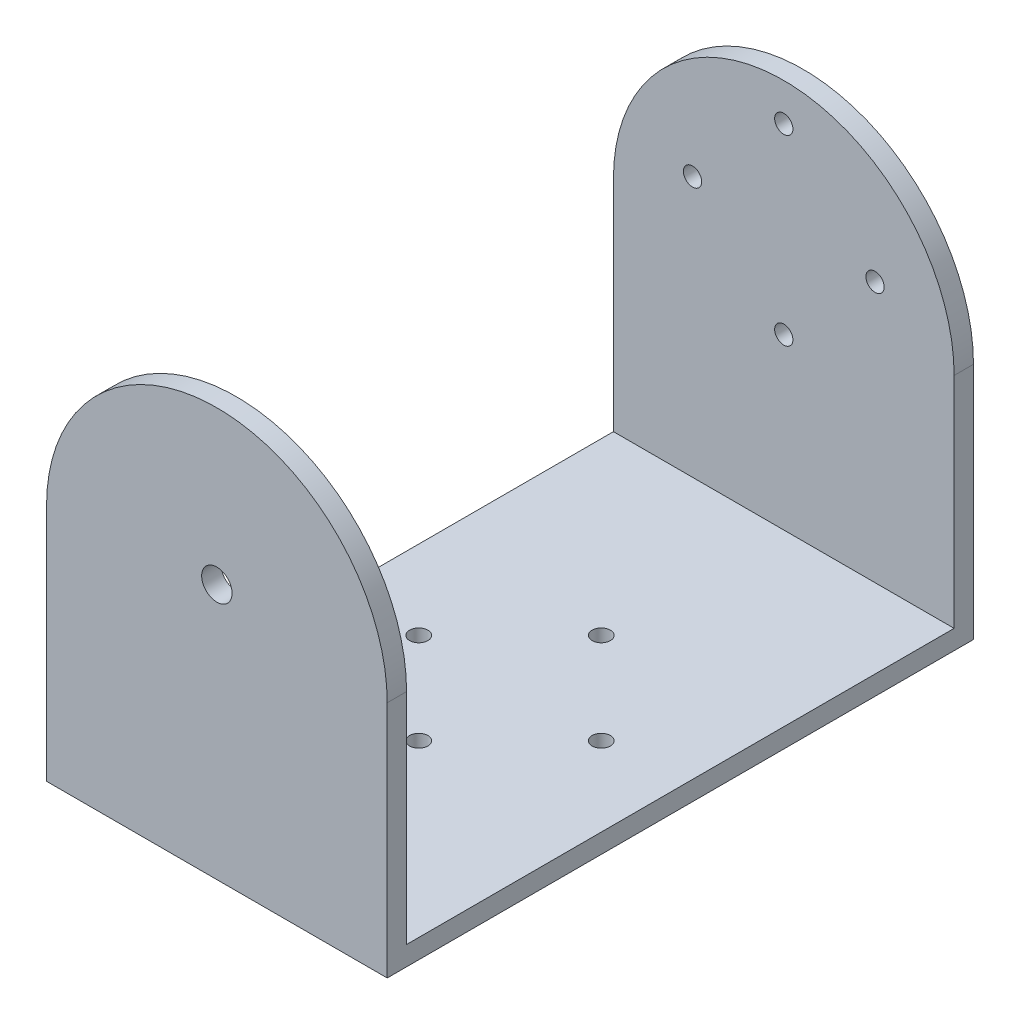
ISO-10303-21;
HEADER;
FILE_DESCRIPTION(('STEP AP214'),'2;1');
FILE_NAME('part.step','',(''),(''),'','','');
FILE_SCHEMA(('AUTOMOTIVE_DESIGN { 1 0 10303 214 1 1 1 1 }'));
ENDSEC;
DATA;
#1=APPLICATION_CONTEXT('core data for automotive mechanical design processes');
#2=APPLICATION_PROTOCOL_DEFINITION('international standard','automotive_design',2000,#1);
#3=PRODUCT_CONTEXT('',#1,'mechanical');
#4=PRODUCT('Part','Part','',(#3));
#5=PRODUCT_RELATED_PRODUCT_CATEGORY('part','',(#4));
#6=PRODUCT_DEFINITION_FORMATION('','',#4);
#7=PRODUCT_DEFINITION_CONTEXT('part definition',#1,'design');
#8=PRODUCT_DEFINITION('design','',#6,#7);
#9=PRODUCT_DEFINITION_SHAPE('','',#8);
#10=(LENGTH_UNIT() NAMED_UNIT(*) SI_UNIT(.MILLI.,.METRE.));
#11=(NAMED_UNIT(*) PLANE_ANGLE_UNIT() SI_UNIT($,.RADIAN.));
#12=(NAMED_UNIT(*) SI_UNIT($,.STERADIAN.) SOLID_ANGLE_UNIT());
#13=UNCERTAINTY_MEASURE_WITH_UNIT(LENGTH_MEASURE(1.E-05),#10,'distance_accuracy_value','');
#14=(GEOMETRIC_REPRESENTATION_CONTEXT(3) GLOBAL_UNCERTAINTY_ASSIGNED_CONTEXT((#13)) GLOBAL_UNIT_ASSIGNED_CONTEXT((#10,
#11,#12)) REPRESENTATION_CONTEXT('',''));
#15=CARTESIAN_POINT('',(0.,0.,0.));
#16=DIRECTION('',(0.,0.,1.));
#17=DIRECTION('',(1.,0.,0.));
#18=AXIS2_PLACEMENT_3D('',#15,#16,#17);
#19=CARTESIAN_POINT('',(0.,1.59,0.));
#20=DIRECTION('',(0.,1.,0.));
#21=DIRECTION('',(0.,0.,1.));
#22=AXIS2_PLACEMENT_3D('',#19,#20,#21);
#23=PLANE('',#22);
#24=CARTESIAN_POINT('',(7.5,1.59,0.));
#25=DIRECTION('',(0.,1.,0.));
#26=DIRECTION('',(0.,0.,1.));
#27=AXIS2_PLACEMENT_3D('',#24,#25,#26);
#28=CIRCLE('',#27,0.75);
#29=CARTESIAN_POINT('',(7.5,1.59,-0.75));
#30=VERTEX_POINT('',#29);
#31=EDGE_CURVE('E158',#30,#30,#28,.T.);
#32=ORIENTED_EDGE('',*,*,#31,.F.);
#33=EDGE_LOOP('',(#32));
#34=FACE_BOUND('',#33,.T.);
#35=CARTESIAN_POINT('',(0.,1.59,-7.5));
#36=DIRECTION('',(0.,1.,0.));
#37=DIRECTION('',(0.,0.,1.));
#38=AXIS2_PLACEMENT_3D('',#35,#36,#37);
#39=CIRCLE('',#38,0.75);
#40=CARTESIAN_POINT('',(0.,1.59,-8.25));
#41=VERTEX_POINT('',#40);
#42=EDGE_CURVE('E170',#41,#41,#39,.T.);
#43=ORIENTED_EDGE('',*,*,#42,.F.);
#44=EDGE_LOOP('',(#43));
#45=FACE_BOUND('',#44,.T.);
#46=CARTESIAN_POINT('',(0.,1.59,7.5));
#47=DIRECTION('',(0.,1.,0.));
#48=DIRECTION('',(0.,0.,1.));
#49=AXIS2_PLACEMENT_3D('',#46,#47,#48);
#50=CIRCLE('',#49,0.75);
#51=CARTESIAN_POINT('',(0.,1.59,6.75));
#52=VERTEX_POINT('',#51);
#53=EDGE_CURVE('E164',#52,#52,#50,.T.);
#54=ORIENTED_EDGE('',*,*,#53,.F.);
#55=EDGE_LOOP('',(#54));
#56=FACE_BOUND('',#55,.T.);
#57=CARTESIAN_POINT('',(-7.5,1.59,0.));
#58=DIRECTION('',(0.,1.,0.));
#59=DIRECTION('',(0.,0.,1.));
#60=AXIS2_PLACEMENT_3D('',#57,#58,#59);
#61=CIRCLE('',#60,0.75);
#62=CARTESIAN_POINT('',(-7.5,1.59,-0.75));
#63=VERTEX_POINT('',#62);
#64=EDGE_CURVE('E152',#63,#63,#61,.T.);
#65=ORIENTED_EDGE('',*,*,#64,.F.);
#66=EDGE_LOOP('',(#65));
#67=FACE_BOUND('',#66,.T.);
#68=DIRECTION('',(0.,0.,1.));
#69=VECTOR('',#68,1.);
#70=CARTESIAN_POINT('',(-14.,1.59,-24.09));
#71=LINE('',#70,#69);
#72=CARTESIAN_POINT('',(-14.,1.59,-22.5));
#73=VERTEX_POINT('',#72);
#74=CARTESIAN_POINT('',(-14.,1.59,22.5));
#75=VERTEX_POINT('',#74);
#76=EDGE_CURVE('E56',#73,#75,#71,.T.);
#77=ORIENTED_EDGE('',*,*,#76,.T.);
#78=DIRECTION('',(-1.,0.,0.));
#79=VECTOR('',#78,1.);
#80=CARTESIAN_POINT('',(-14.,1.59,22.5));
#81=LINE('',#80,#79);
#82=CARTESIAN_POINT('',(14.,1.59,22.5));
#83=VERTEX_POINT('',#82);
#84=EDGE_CURVE('E51',#83,#75,#81,.T.);
#85=ORIENTED_EDGE('',*,*,#84,.F.);
#86=DIRECTION('',(0.,0.,-1.));
#87=VECTOR('',#86,1.);
#88=CARTESIAN_POINT('',(14.,1.59,-24.09));
#89=LINE('',#88,#87);
#90=CARTESIAN_POINT('',(14.,1.59,-22.5));
#91=VERTEX_POINT('',#90);
#92=EDGE_CURVE('E176',#83,#91,#89,.T.);
#93=ORIENTED_EDGE('',*,*,#92,.T.);
#94=DIRECTION('',(1.,0.,0.));
#95=VECTOR('',#94,1.);
#96=CARTESIAN_POINT('',(-14.,1.59,-22.5));
#97=LINE('',#96,#95);
#98=EDGE_CURVE('E116',#73,#91,#97,.T.);
#99=ORIENTED_EDGE('',*,*,#98,.F.);
#100=EDGE_LOOP('',(#77,#85,#93,#99));
#101=FACE_BOUND('',#100,.T.);
#102=ADVANCED_FACE('F34',(#34,#45,#56,#67,#101),#23,.T.);
#103=CARTESIAN_POINT('',(0.,0.,0.));
#104=DIRECTION('',(0.,1.,0.));
#105=DIRECTION('',(0.,0.,1.));
#106=AXIS2_PLACEMENT_3D('',#103,#104,#105);
#107=PLANE('',#106);
#108=DIRECTION('',(0.,0.,-1.));
#109=VECTOR('',#108,1.);
#110=CARTESIAN_POINT('',(14.,0.,-24.09));
#111=LINE('',#110,#109);
#112=CARTESIAN_POINT('',(14.,0.,24.09));
#113=VERTEX_POINT('',#112);
#114=CARTESIAN_POINT('',(14.,0.,-24.09));
#115=VERTEX_POINT('',#114);
#116=EDGE_CURVE('E173',#113,#115,#111,.T.);
#117=ORIENTED_EDGE('',*,*,#116,.F.);
#118=DIRECTION('',(1.,0.,0.));
#119=VECTOR('',#118,1.);
#120=CARTESIAN_POINT('',(-14.,0.,24.09));
#121=LINE('',#120,#119);
#122=CARTESIAN_POINT('',(-14.,0.,24.09));
#123=VERTEX_POINT('',#122);
#124=EDGE_CURVE('E178',#123,#113,#121,.T.);
#125=ORIENTED_EDGE('',*,*,#124,.F.);
#126=DIRECTION('',(0.,0.,1.));
#127=VECTOR('',#126,1.);
#128=CARTESIAN_POINT('',(-14.,0.,-24.09));
#129=LINE('',#128,#127);
#130=CARTESIAN_POINT('',(-14.,0.,-24.09));
#131=VERTEX_POINT('',#130);
#132=EDGE_CURVE('E184',#131,#123,#129,.T.);
#133=ORIENTED_EDGE('',*,*,#132,.F.);
#134=DIRECTION('',(-1.,0.,0.));
#135=VECTOR('',#134,1.);
#136=CARTESIAN_POINT('',(-14.,0.,-24.09));
#137=LINE('',#136,#135);
#138=EDGE_CURVE('E182',#115,#131,#137,.T.);
#139=ORIENTED_EDGE('',*,*,#138,.F.);
#140=EDGE_LOOP('',(#117,#125,#133,#139));
#141=FACE_BOUND('',#140,.T.);
#142=CARTESIAN_POINT('',(0.,0.,-7.5));
#143=DIRECTION('',(0.,1.,0.));
#144=DIRECTION('',(0.,0.,1.));
#145=AXIS2_PLACEMENT_3D('',#142,#143,#144);
#146=CIRCLE('',#145,0.75);
#147=CARTESIAN_POINT('',(0.,0.,-8.25));
#148=VERTEX_POINT('',#147);
#149=EDGE_CURVE('E167',#148,#148,#146,.T.);
#150=ORIENTED_EDGE('',*,*,#149,.T.);
#151=EDGE_LOOP('',(#150));
#152=FACE_BOUND('',#151,.T.);
#153=CARTESIAN_POINT('',(0.,0.,7.5));
#154=DIRECTION('',(0.,1.,0.));
#155=DIRECTION('',(0.,0.,1.));
#156=AXIS2_PLACEMENT_3D('',#153,#154,#155);
#157=CIRCLE('',#156,0.75);
#158=CARTESIAN_POINT('',(0.,0.,6.75));
#159=VERTEX_POINT('',#158);
#160=EDGE_CURVE('E161',#159,#159,#157,.T.);
#161=ORIENTED_EDGE('',*,*,#160,.T.);
#162=EDGE_LOOP('',(#161));
#163=FACE_BOUND('',#162,.T.);
#164=CARTESIAN_POINT('',(7.5,0.,0.));
#165=DIRECTION('',(0.,1.,0.));
#166=DIRECTION('',(0.,0.,1.));
#167=AXIS2_PLACEMENT_3D('',#164,#165,#166);
#168=CIRCLE('',#167,0.75);
#169=CARTESIAN_POINT('',(7.5,0.,-0.75));
#170=VERTEX_POINT('',#169);
#171=EDGE_CURVE('E155',#170,#170,#168,.T.);
#172=ORIENTED_EDGE('',*,*,#171,.T.);
#173=EDGE_LOOP('',(#172));
#174=FACE_BOUND('',#173,.T.);
#175=CARTESIAN_POINT('',(-7.5,0.,0.));
#176=DIRECTION('',(0.,1.,0.));
#177=DIRECTION('',(0.,0.,1.));
#178=AXIS2_PLACEMENT_3D('',#175,#176,#177);
#179=CIRCLE('',#178,0.75);
#180=CARTESIAN_POINT('',(-7.5,0.,-0.75));
#181=VERTEX_POINT('',#180);
#182=EDGE_CURVE('E151',#181,#181,#179,.T.);
#183=ORIENTED_EDGE('',*,*,#182,.T.);
#184=EDGE_LOOP('',(#183));
#185=FACE_BOUND('',#184,.T.);
#186=ADVANCED_FACE('F240',(#141,#152,#163,#174,#185),#107,.F.);
#187=CARTESIAN_POINT('',(14.,1.59,-24.09));
#188=DIRECTION('',(-1.,0.,0.));
#189=DIRECTION('',(0.,0.,1.));
#190=AXIS2_PLACEMENT_3D('',#187,#188,#189);
#191=PLANE('',#190);
#192=ORIENTED_EDGE('',*,*,#116,.T.);
#193=DIRECTION('',(0.,-1.,0.));
#194=VECTOR('',#193,1.);
#195=CARTESIAN_POINT('',(14.,1.59,-24.09));
#196=LINE('',#195,#194);
#197=CARTESIAN_POINT('',(14.,19.59,-24.09));
#198=VERTEX_POINT('',#197);
#199=EDGE_CURVE('E11',#198,#115,#196,.T.);
#200=ORIENTED_EDGE('',*,*,#199,.F.);
#201=DIRECTION('',(0.,0.,-1.));
#202=VECTOR('',#201,1.);
#203=CARTESIAN_POINT('',(14.,19.59,-24.09));
#204=LINE('',#203,#202);
#205=CARTESIAN_POINT('',(14.,19.59,-22.5));
#206=VERTEX_POINT('',#205);
#207=EDGE_CURVE('E99',#206,#198,#204,.T.);
#208=ORIENTED_EDGE('',*,*,#207,.F.);
#209=DIRECTION('',(0.,-1.,0.));
#210=VECTOR('',#209,1.);
#211=CARTESIAN_POINT('',(14.,19.59,-22.5));
#212=LINE('',#211,#210);
#213=EDGE_CURVE('E102',#206,#91,#212,.T.);
#214=ORIENTED_EDGE('',*,*,#213,.T.);
#215=ORIENTED_EDGE('',*,*,#92,.F.);
#216=DIRECTION('',(0.,-1.,0.));
#217=VECTOR('',#216,1.);
#218=CARTESIAN_POINT('',(14.,19.59,22.5));
#219=LINE('',#218,#217);
#220=CARTESIAN_POINT('',(14.,19.59,22.5));
#221=VERTEX_POINT('',#220);
#222=EDGE_CURVE('E145',#221,#83,#219,.T.);
#223=ORIENTED_EDGE('',*,*,#222,.F.);
#224=DIRECTION('',(0.,0.,-1.));
#225=VECTOR('',#224,1.);
#226=CARTESIAN_POINT('',(14.,19.59,24.09));
#227=LINE('',#226,#225);
#228=CARTESIAN_POINT('',(14.,19.59,24.09));
#229=VERTEX_POINT('',#228);
#230=EDGE_CURVE('E138',#229,#221,#227,.T.);
#231=ORIENTED_EDGE('',*,*,#230,.F.);
#232=DIRECTION('',(0.,-1.,0.));
#233=VECTOR('',#232,1.);
#234=CARTESIAN_POINT('',(14.,1.59,24.09));
#235=LINE('',#234,#233);
#236=EDGE_CURVE('E180',#229,#113,#235,.T.);
#237=ORIENTED_EDGE('',*,*,#236,.T.);
#238=EDGE_LOOP('',(#192,#200,#208,#214,#215,#223,#231,#237));
#239=FACE_BOUND('',#238,.T.);
#240=ADVANCED_FACE('F36',(#239),#191,.F.);
#241=CARTESIAN_POINT('',(-14.,1.59,-24.09));
#242=DIRECTION('',(0.,0.,1.));
#243=DIRECTION('',(1.,0.,0.));
#244=AXIS2_PLACEMENT_3D('',#241,#242,#243);
#245=PLANE('',#244);
#246=CARTESIAN_POINT('',(0.,15.5,-24.09));
#247=DIRECTION('',(0.,0.,-1.));
#248=DIRECTION('',(-1.,0.,0.));
#249=AXIS2_PLACEMENT_3D('',#246,#247,#248);
#250=CIRCLE('',#249,0.750000000000001);
#251=CARTESIAN_POINT('',(-0.750000000000001,15.5,-24.09));
#252=VERTEX_POINT('',#251);
#253=EDGE_CURVE('E203',#252,#252,#250,.T.);
#254=ORIENTED_EDGE('',*,*,#253,.F.);
#255=EDGE_LOOP('',(#254));
#256=FACE_BOUND('',#255,.T.);
#257=CARTESIAN_POINT('',(-7.5,23.,-24.09));
#258=DIRECTION('',(0.,0.,-1.));
#259=DIRECTION('',(-1.,0.,0.));
#260=AXIS2_PLACEMENT_3D('',#257,#258,#259);
#261=CIRCLE('',#260,0.75);
#262=CARTESIAN_POINT('',(-8.25,23.,-24.09));
#263=VERTEX_POINT('',#262);
#264=EDGE_CURVE('E217',#263,#263,#261,.T.);
#265=ORIENTED_EDGE('',*,*,#264,.F.);
#266=EDGE_LOOP('',(#265));
#267=FACE_BOUND('',#266,.T.);
#268=CARTESIAN_POINT('',(7.5,23.,-24.09));
#269=DIRECTION('',(0.,0.,-1.));
#270=DIRECTION('',(-1.,0.,0.));
#271=AXIS2_PLACEMENT_3D('',#268,#269,#270);
#272=CIRCLE('',#271,0.75);
#273=CARTESIAN_POINT('',(6.75,23.,-24.09));
#274=VERTEX_POINT('',#273);
#275=EDGE_CURVE('E214',#274,#274,#272,.T.);
#276=ORIENTED_EDGE('',*,*,#275,.F.);
#277=EDGE_LOOP('',(#276));
#278=FACE_BOUND('',#277,.T.);
#279=CARTESIAN_POINT('',(0.,30.5,-24.09));
#280=DIRECTION('',(0.,0.,-1.));
#281=DIRECTION('',(-1.,0.,0.));
#282=AXIS2_PLACEMENT_3D('',#279,#280,#281);
#283=CIRCLE('',#282,0.750000000000001);
#284=CARTESIAN_POINT('',(-0.750000000000001,30.5,-24.09));
#285=VERTEX_POINT('',#284);
#286=EDGE_CURVE('E199',#285,#285,#283,.T.);
#287=ORIENTED_EDGE('',*,*,#286,.F.);
#288=EDGE_LOOP('',(#287));
#289=FACE_BOUND('',#288,.T.);
#290=ORIENTED_EDGE('',*,*,#138,.T.);
#291=DIRECTION('',(0.,-1.,0.));
#292=VECTOR('',#291,1.);
#293=CARTESIAN_POINT('',(-14.,1.59,-24.09));
#294=LINE('',#293,#292);
#295=CARTESIAN_POINT('',(-14.,19.59,-24.09));
#296=VERTEX_POINT('',#295);
#297=EDGE_CURVE('E43',#296,#131,#294,.T.);
#298=ORIENTED_EDGE('',*,*,#297,.F.);
#299=CARTESIAN_POINT('',(0.,19.59,-24.09));
#300=DIRECTION('',(0.,0.,-1.));
#301=DIRECTION('',(-1.,0.,0.));
#302=AXIS2_PLACEMENT_3D('',#299,#300,#301);
#303=CIRCLE('',#302,14.);
#304=EDGE_CURVE('E122',#296,#198,#303,.T.);
#305=ORIENTED_EDGE('',*,*,#304,.T.);
#306=ORIENTED_EDGE('',*,*,#199,.T.);
#307=EDGE_LOOP('',(#290,#298,#305,#306));
#308=FACE_BOUND('',#307,.T.);
#309=ADVANCED_FACE('F226',(#256,#267,#278,#289,#308),#245,.F.);
#310=CARTESIAN_POINT('',(-14.,1.59,-24.09));
#311=DIRECTION('',(1.,0.,0.));
#312=DIRECTION('',(0.,0.,-1.));
#313=AXIS2_PLACEMENT_3D('',#310,#311,#312);
#314=PLANE('',#313);
#315=ORIENTED_EDGE('',*,*,#132,.T.);
#316=DIRECTION('',(0.,-1.,0.));
#317=VECTOR('',#316,1.);
#318=CARTESIAN_POINT('',(-14.,1.59,24.09));
#319=LINE('',#318,#317);
#320=CARTESIAN_POINT('',(-14.,19.59,24.09));
#321=VERTEX_POINT('',#320);
#322=EDGE_CURVE('E189',#321,#123,#319,.T.);
#323=ORIENTED_EDGE('',*,*,#322,.F.);
#324=DIRECTION('',(0.,0.,1.));
#325=VECTOR('',#324,1.);
#326=CARTESIAN_POINT('',(-14.,19.59,24.09));
#327=LINE('',#326,#325);
#328=CARTESIAN_POINT('',(-14.,19.59,22.5));
#329=VERTEX_POINT('',#328);
#330=EDGE_CURVE('E135',#329,#321,#327,.T.);
#331=ORIENTED_EDGE('',*,*,#330,.F.);
#332=DIRECTION('',(0.,-1.,0.));
#333=VECTOR('',#332,1.);
#334=CARTESIAN_POINT('',(-14.,19.59,22.5));
#335=LINE('',#334,#333);
#336=EDGE_CURVE('E141',#329,#75,#335,.T.);
#337=ORIENTED_EDGE('',*,*,#336,.T.);
#338=ORIENTED_EDGE('',*,*,#76,.F.);
#339=DIRECTION('',(0.,-1.,0.));
#340=VECTOR('',#339,1.);
#341=CARTESIAN_POINT('',(-14.,19.59,-22.5));
#342=LINE('',#341,#340);
#343=CARTESIAN_POINT('',(-14.,19.59,-22.5));
#344=VERTEX_POINT('',#343);
#345=EDGE_CURVE('E117',#344,#73,#342,.T.);
#346=ORIENTED_EDGE('',*,*,#345,.F.);
#347=DIRECTION('',(0.,0.,1.));
#348=VECTOR('',#347,1.);
#349=CARTESIAN_POINT('',(-14.,19.59,-24.09));
#350=LINE('',#349,#348);
#351=EDGE_CURVE('E107',#296,#344,#350,.T.);
#352=ORIENTED_EDGE('',*,*,#351,.F.);
#353=ORIENTED_EDGE('',*,*,#297,.T.);
#354=EDGE_LOOP('',(#315,#323,#331,#337,#338,#346,#352,#353));
#355=FACE_BOUND('',#354,.T.);
#356=ADVANCED_FACE('F229',(#355),#314,.F.);
#357=CARTESIAN_POINT('',(-14.,1.59,24.09));
#358=DIRECTION('',(0.,0.,-1.));
#359=DIRECTION('',(-1.,0.,0.));
#360=AXIS2_PLACEMENT_3D('',#357,#358,#359);
#361=PLANE('',#360);
#362=CARTESIAN_POINT('',(0.,21.,24.09));
#363=DIRECTION('',(0.,0.,1.));
#364=DIRECTION('',(1.,0.,0.));
#365=AXIS2_PLACEMENT_3D('',#362,#363,#364);
#366=CIRCLE('',#365,1.25);
#367=CARTESIAN_POINT('',(1.25,21.,24.09));
#368=VERTEX_POINT('',#367);
#369=EDGE_CURVE('E130',#368,#368,#366,.T.);
#370=ORIENTED_EDGE('',*,*,#369,.F.);
#371=EDGE_LOOP('',(#370));
#372=FACE_BOUND('',#371,.T.);
#373=ORIENTED_EDGE('',*,*,#124,.T.);
#374=ORIENTED_EDGE('',*,*,#236,.F.);
#375=CARTESIAN_POINT('',(0.,19.59,24.09));
#376=DIRECTION('',(0.,0.,1.));
#377=DIRECTION('',(1.,0.,0.));
#378=AXIS2_PLACEMENT_3D('',#375,#376,#377);
#379=CIRCLE('',#378,14.);
#380=EDGE_CURVE('E121',#229,#321,#379,.T.);
#381=ORIENTED_EDGE('',*,*,#380,.T.);
#382=ORIENTED_EDGE('',*,*,#322,.T.);
#383=EDGE_LOOP('',(#373,#374,#381,#382));
#384=FACE_BOUND('',#383,.T.);
#385=ADVANCED_FACE('F243',(#372,#384),#361,.F.);
#386=CARTESIAN_POINT('',(0.,1.59,-7.5));
#387=DIRECTION('',(0.,-1.,0.));
#388=DIRECTION('',(0.,0.,-1.));
#389=AXIS2_PLACEMENT_3D('',#386,#387,#388);
#390=CYLINDRICAL_SURFACE('',#389,0.75);
#391=CARTESIAN_POINT('',(0.,1.59,-8.25));
#392=CARTESIAN_POINT('',(0.,1.5734375,-8.25));
#393=CARTESIAN_POINT('',(0.,1.556875,-8.25));
#394=CARTESIAN_POINT('',(0.,1.52375,-8.25));
#395=CARTESIAN_POINT('',(0.,1.5071875,-8.25));
#396=CARTESIAN_POINT('',(0.,1.4740625,-8.25));
#397=CARTESIAN_POINT('',(0.,1.4575,-8.25));
#398=CARTESIAN_POINT('',(0.,1.424375,-8.25));
#399=CARTESIAN_POINT('',(0.,1.4078125,-8.25));
#400=CARTESIAN_POINT('',(0.,1.3746875,-8.25));
#401=CARTESIAN_POINT('',(0.,1.358125,-8.25));
#402=CARTESIAN_POINT('',(0.,1.325,-8.25));
#403=CARTESIAN_POINT('',(0.,1.3084375,-8.25));
#404=CARTESIAN_POINT('',(0.,1.2753125,-8.25));
#405=CARTESIAN_POINT('',(0.,1.25875,-8.25));
#406=CARTESIAN_POINT('',(0.,1.225625,-8.25));
#407=CARTESIAN_POINT('',(0.,1.2090625,-8.25));
#408=CARTESIAN_POINT('',(0.,1.1759375,-8.25));
#409=CARTESIAN_POINT('',(0.,1.159375,-8.25));
#410=CARTESIAN_POINT('',(0.,1.12625,-8.25));
#411=CARTESIAN_POINT('',(0.,1.1096875,-8.25));
#412=CARTESIAN_POINT('',(0.,1.0765625,-8.25));
#413=CARTESIAN_POINT('',(0.,1.06,-8.25));
#414=CARTESIAN_POINT('',(0.,1.026875,-8.25));
#415=CARTESIAN_POINT('',(0.,1.0103125,-8.25));
#416=CARTESIAN_POINT('',(0.,0.9771875,-8.25));
#417=CARTESIAN_POINT('',(0.,0.960625,-8.25));
#418=CARTESIAN_POINT('',(0.,0.9275,-8.25));
#419=CARTESIAN_POINT('',(0.,0.9109375,-8.25));
#420=CARTESIAN_POINT('',(0.,0.8778125,-8.25));
#421=CARTESIAN_POINT('',(0.,0.86125,-8.25));
#422=CARTESIAN_POINT('',(0.,0.828125,-8.25));
#423=CARTESIAN_POINT('',(0.,0.8115625,-8.25));
#424=CARTESIAN_POINT('',(0.,0.7784375,-8.25));
#425=CARTESIAN_POINT('',(0.,0.761875,-8.25));
#426=CARTESIAN_POINT('',(0.,0.72875,-8.25));
#427=CARTESIAN_POINT('',(0.,0.7121875,-8.25));
#428=CARTESIAN_POINT('',(0.,0.6790625,-8.25));
#429=CARTESIAN_POINT('',(0.,0.6625,-8.25));
#430=CARTESIAN_POINT('',(0.,0.629375,-8.25));
#431=CARTESIAN_POINT('',(0.,0.6128125,-8.25));
#432=CARTESIAN_POINT('',(0.,0.5796875,-8.25));
#433=CARTESIAN_POINT('',(0.,0.563125,-8.25));
#434=CARTESIAN_POINT('',(0.,0.53,-8.25));
#435=CARTESIAN_POINT('',(0.,0.5134375,-8.25));
#436=CARTESIAN_POINT('',(0.,0.4803125,-8.25));
#437=CARTESIAN_POINT('',(0.,0.46375,-8.25));
#438=CARTESIAN_POINT('',(0.,0.430625,-8.25));
#439=CARTESIAN_POINT('',(0.,0.4140625,-8.25));
#440=CARTESIAN_POINT('',(0.,0.3809375,-8.25));
#441=CARTESIAN_POINT('',(0.,0.364375,-8.25));
#442=CARTESIAN_POINT('',(0.,0.33125,-8.25));
#443=CARTESIAN_POINT('',(0.,0.3146875,-8.25));
#444=CARTESIAN_POINT('',(0.,0.2815625,-8.25));
#445=CARTESIAN_POINT('',(0.,0.265,-8.25));
#446=CARTESIAN_POINT('',(0.,0.231875,-8.25));
#447=CARTESIAN_POINT('',(0.,0.2153125,-8.25));
#448=CARTESIAN_POINT('',(0.,0.1821875,-8.25));
#449=CARTESIAN_POINT('',(0.,0.165625,-8.25));
#450=CARTESIAN_POINT('',(0.,0.1325,-8.25));
#451=CARTESIAN_POINT('',(0.,0.1159375,-8.25));
#452=CARTESIAN_POINT('',(0.,0.0828125000000001,-8.25));
#453=CARTESIAN_POINT('',(0.,0.06625,-8.25));
#454=CARTESIAN_POINT('',(0.,0.033125,-8.25));
#455=CARTESIAN_POINT('',(0.,0.0165625,-8.25));
#456=CARTESIAN_POINT('',(0.,0.,-8.25));
#457=B_SPLINE_CURVE_WITH_KNOTS('',3,(#391,#392,#393,#394,#395,#396,#397,#398,#399,#400,#401,
#402,#403,#404,#405,#406,#407,#408,#409,#410,#411,#412,#413,#414,#415,#416,#417,#418,#419,#420,
#421,#422,#423,#424,#425,#426,#427,#428,#429,#430,#431,#432,#433,#434,#435,#436,#437,#438,#439,
#440,#441,#442,#443,#444,#445,#446,#447,#448,#449,#450,#451,#452,#453,#454,#455,#456),
.UNSPECIFIED.,.F.,.F.,(4,2,2,2,2,2,2,2,2,2,2,2,2,2,2,2,2,2,2,2,2,2,2,2,2,2,2,2,2,2,2,2,4),(0.,
0.0496874999999998,0.0993749999999999,0.1490625,0.19875,0.2484375,0.298125,0.3478125,0.3975,
0.4471875,0.496875,0.5465625,0.59625,0.6459375,0.695625,0.7453125,0.795,0.8446875,0.894375,
0.9440625,0.99375,1.0434375,1.093125,1.1428125,1.1925,1.2421875,1.291875,1.3415625,1.39125,
1.4409375,1.490625,1.5403125,1.59),.UNSPECIFIED.);
#458=EDGE_CURVE('BSEAM272',#41,#148,#457,.T.);
#459=ORIENTED_EDGE('',*,*,#42,.T.);
#460=ORIENTED_EDGE('',*,*,#149,.F.);
#461=ORIENTED_EDGE('',*,*,#458,.T.);
#462=ORIENTED_EDGE('',*,*,#458,.F.);
#463=EDGE_LOOP('',(#459,#461,#460,#462));
#464=FACE_BOUND('',#463,.T.);
#465=ADVANCED_FACE('F272',(#464),#390,.F.);
#466=CARTESIAN_POINT('',(0.,1.59,7.5));
#467=DIRECTION('',(0.,-1.,0.));
#468=DIRECTION('',(0.,0.,-1.));
#469=AXIS2_PLACEMENT_3D('',#466,#467,#468);
#470=CYLINDRICAL_SURFACE('',#469,0.75);
#471=CARTESIAN_POINT('',(0.,1.59,6.75));
#472=CARTESIAN_POINT('',(0.,1.5734375,6.75));
#473=CARTESIAN_POINT('',(0.,1.556875,6.75));
#474=CARTESIAN_POINT('',(0.,1.52375,6.75));
#475=CARTESIAN_POINT('',(0.,1.5071875,6.75));
#476=CARTESIAN_POINT('',(0.,1.4740625,6.75));
#477=CARTESIAN_POINT('',(0.,1.4575,6.75));
#478=CARTESIAN_POINT('',(0.,1.424375,6.75));
#479=CARTESIAN_POINT('',(0.,1.4078125,6.75));
#480=CARTESIAN_POINT('',(0.,1.3746875,6.75));
#481=CARTESIAN_POINT('',(0.,1.358125,6.75));
#482=CARTESIAN_POINT('',(0.,1.325,6.75));
#483=CARTESIAN_POINT('',(0.,1.3084375,6.75));
#484=CARTESIAN_POINT('',(0.,1.2753125,6.75));
#485=CARTESIAN_POINT('',(0.,1.25875,6.75));
#486=CARTESIAN_POINT('',(0.,1.225625,6.75));
#487=CARTESIAN_POINT('',(0.,1.2090625,6.75));
#488=CARTESIAN_POINT('',(0.,1.1759375,6.75));
#489=CARTESIAN_POINT('',(0.,1.159375,6.75));
#490=CARTESIAN_POINT('',(0.,1.12625,6.75));
#491=CARTESIAN_POINT('',(0.,1.1096875,6.75));
#492=CARTESIAN_POINT('',(0.,1.0765625,6.75));
#493=CARTESIAN_POINT('',(0.,1.06,6.75));
#494=CARTESIAN_POINT('',(0.,1.026875,6.75));
#495=CARTESIAN_POINT('',(0.,1.0103125,6.75));
#496=CARTESIAN_POINT('',(0.,0.9771875,6.75));
#497=CARTESIAN_POINT('',(0.,0.960625,6.75));
#498=CARTESIAN_POINT('',(0.,0.9275,6.75));
#499=CARTESIAN_POINT('',(0.,0.9109375,6.75));
#500=CARTESIAN_POINT('',(0.,0.8778125,6.75));
#501=CARTESIAN_POINT('',(0.,0.86125,6.75));
#502=CARTESIAN_POINT('',(0.,0.828125,6.75));
#503=CARTESIAN_POINT('',(0.,0.8115625,6.75));
#504=CARTESIAN_POINT('',(0.,0.7784375,6.75));
#505=CARTESIAN_POINT('',(0.,0.761875,6.75));
#506=CARTESIAN_POINT('',(0.,0.72875,6.75));
#507=CARTESIAN_POINT('',(0.,0.7121875,6.75));
#508=CARTESIAN_POINT('',(0.,0.6790625,6.75));
#509=CARTESIAN_POINT('',(0.,0.6625,6.75));
#510=CARTESIAN_POINT('',(0.,0.629375,6.75));
#511=CARTESIAN_POINT('',(0.,0.6128125,6.75));
#512=CARTESIAN_POINT('',(0.,0.5796875,6.75));
#513=CARTESIAN_POINT('',(0.,0.563125,6.75));
#514=CARTESIAN_POINT('',(0.,0.53,6.75));
#515=CARTESIAN_POINT('',(0.,0.5134375,6.75));
#516=CARTESIAN_POINT('',(0.,0.4803125,6.75));
#517=CARTESIAN_POINT('',(0.,0.46375,6.75));
#518=CARTESIAN_POINT('',(0.,0.430625,6.75));
#519=CARTESIAN_POINT('',(0.,0.4140625,6.75));
#520=CARTESIAN_POINT('',(0.,0.3809375,6.75));
#521=CARTESIAN_POINT('',(0.,0.364375,6.75));
#522=CARTESIAN_POINT('',(0.,0.33125,6.75));
#523=CARTESIAN_POINT('',(0.,0.3146875,6.75));
#524=CARTESIAN_POINT('',(0.,0.2815625,6.75));
#525=CARTESIAN_POINT('',(0.,0.265,6.75));
#526=CARTESIAN_POINT('',(0.,0.231875,6.75));
#527=CARTESIAN_POINT('',(0.,0.2153125,6.75));
#528=CARTESIAN_POINT('',(0.,0.1821875,6.75));
#529=CARTESIAN_POINT('',(0.,0.165625,6.75));
#530=CARTESIAN_POINT('',(0.,0.1325,6.75));
#531=CARTESIAN_POINT('',(0.,0.1159375,6.75));
#532=CARTESIAN_POINT('',(0.,0.0828125000000001,6.75));
#533=CARTESIAN_POINT('',(0.,0.06625,6.75));
#534=CARTESIAN_POINT('',(0.,0.033125,6.75));
#535=CARTESIAN_POINT('',(0.,0.0165625,6.75));
#536=CARTESIAN_POINT('',(0.,0.,6.75));
#537=B_SPLINE_CURVE_WITH_KNOTS('',3,(#471,#472,#473,#474,#475,#476,#477,#478,#479,#480,#481,
#482,#483,#484,#485,#486,#487,#488,#489,#490,#491,#492,#493,#494,#495,#496,#497,#498,#499,#500,
#501,#502,#503,#504,#505,#506,#507,#508,#509,#510,#511,#512,#513,#514,#515,#516,#517,#518,#519,
#520,#521,#522,#523,#524,#525,#526,#527,#528,#529,#530,#531,#532,#533,#534,#535,#536),
.UNSPECIFIED.,.F.,.F.,(4,2,2,2,2,2,2,2,2,2,2,2,2,2,2,2,2,2,2,2,2,2,2,2,2,2,2,2,2,2,2,2,4),(0.,
0.0496874999999998,0.0993749999999999,0.1490625,0.19875,0.2484375,0.298125,0.3478125,0.3975,
0.4471875,0.496875,0.5465625,0.59625,0.6459375,0.695625,0.7453125,0.795,0.8446875,0.894375,
0.9440625,0.99375,1.0434375,1.093125,1.1428125,1.1925,1.2421875,1.291875,1.3415625,1.39125,
1.4409375,1.490625,1.5403125,1.59),.UNSPECIFIED.);
#538=EDGE_CURVE('BSEAM296',#52,#159,#537,.T.);
#539=ORIENTED_EDGE('',*,*,#53,.T.);
#540=ORIENTED_EDGE('',*,*,#160,.F.);
#541=ORIENTED_EDGE('',*,*,#538,.T.);
#542=ORIENTED_EDGE('',*,*,#538,.F.);
#543=EDGE_LOOP('',(#539,#541,#540,#542));
#544=FACE_BOUND('',#543,.T.);
#545=ADVANCED_FACE('F296',(#544),#470,.F.);
#546=CARTESIAN_POINT('',(7.5,1.59,0.));
#547=DIRECTION('',(0.,-1.,0.));
#548=DIRECTION('',(0.,0.,-1.));
#549=AXIS2_PLACEMENT_3D('',#546,#547,#548);
#550=CYLINDRICAL_SURFACE('',#549,0.75);
#551=CARTESIAN_POINT('',(7.5,1.59,-0.75));
#552=CARTESIAN_POINT('',(7.5,1.5734375,-0.75));
#553=CARTESIAN_POINT('',(7.5,1.556875,-0.75));
#554=CARTESIAN_POINT('',(7.5,1.52375,-0.75));
#555=CARTESIAN_POINT('',(7.5,1.5071875,-0.75));
#556=CARTESIAN_POINT('',(7.5,1.4740625,-0.75));
#557=CARTESIAN_POINT('',(7.5,1.4575,-0.75));
#558=CARTESIAN_POINT('',(7.5,1.424375,-0.75));
#559=CARTESIAN_POINT('',(7.5,1.4078125,-0.75));
#560=CARTESIAN_POINT('',(7.5,1.3746875,-0.75));
#561=CARTESIAN_POINT('',(7.5,1.358125,-0.75));
#562=CARTESIAN_POINT('',(7.5,1.325,-0.75));
#563=CARTESIAN_POINT('',(7.5,1.3084375,-0.75));
#564=CARTESIAN_POINT('',(7.5,1.2753125,-0.75));
#565=CARTESIAN_POINT('',(7.5,1.25875,-0.75));
#566=CARTESIAN_POINT('',(7.5,1.225625,-0.75));
#567=CARTESIAN_POINT('',(7.5,1.2090625,-0.75));
#568=CARTESIAN_POINT('',(7.5,1.1759375,-0.75));
#569=CARTESIAN_POINT('',(7.5,1.159375,-0.75));
#570=CARTESIAN_POINT('',(7.5,1.12625,-0.75));
#571=CARTESIAN_POINT('',(7.5,1.1096875,-0.75));
#572=CARTESIAN_POINT('',(7.5,1.0765625,-0.75));
#573=CARTESIAN_POINT('',(7.5,1.06,-0.75));
#574=CARTESIAN_POINT('',(7.5,1.026875,-0.75));
#575=CARTESIAN_POINT('',(7.5,1.0103125,-0.75));
#576=CARTESIAN_POINT('',(7.5,0.9771875,-0.75));
#577=CARTESIAN_POINT('',(7.5,0.960625,-0.75));
#578=CARTESIAN_POINT('',(7.5,0.9275,-0.75));
#579=CARTESIAN_POINT('',(7.5,0.9109375,-0.75));
#580=CARTESIAN_POINT('',(7.5,0.8778125,-0.75));
#581=CARTESIAN_POINT('',(7.5,0.86125,-0.75));
#582=CARTESIAN_POINT('',(7.5,0.828125,-0.75));
#583=CARTESIAN_POINT('',(7.5,0.8115625,-0.75));
#584=CARTESIAN_POINT('',(7.5,0.7784375,-0.75));
#585=CARTESIAN_POINT('',(7.5,0.761875,-0.75));
#586=CARTESIAN_POINT('',(7.5,0.72875,-0.75));
#587=CARTESIAN_POINT('',(7.5,0.7121875,-0.75));
#588=CARTESIAN_POINT('',(7.5,0.6790625,-0.75));
#589=CARTESIAN_POINT('',(7.5,0.6625,-0.75));
#590=CARTESIAN_POINT('',(7.5,0.629375,-0.75));
#591=CARTESIAN_POINT('',(7.5,0.6128125,-0.75));
#592=CARTESIAN_POINT('',(7.5,0.5796875,-0.75));
#593=CARTESIAN_POINT('',(7.5,0.563125,-0.75));
#594=CARTESIAN_POINT('',(7.5,0.53,-0.75));
#595=CARTESIAN_POINT('',(7.5,0.5134375,-0.75));
#596=CARTESIAN_POINT('',(7.5,0.4803125,-0.75));
#597=CARTESIAN_POINT('',(7.5,0.46375,-0.75));
#598=CARTESIAN_POINT('',(7.5,0.430625,-0.75));
#599=CARTESIAN_POINT('',(7.5,0.4140625,-0.75));
#600=CARTESIAN_POINT('',(7.5,0.3809375,-0.75));
#601=CARTESIAN_POINT('',(7.5,0.364375,-0.75));
#602=CARTESIAN_POINT('',(7.5,0.33125,-0.75));
#603=CARTESIAN_POINT('',(7.5,0.3146875,-0.75));
#604=CARTESIAN_POINT('',(7.5,0.2815625,-0.75));
#605=CARTESIAN_POINT('',(7.5,0.265,-0.75));
#606=CARTESIAN_POINT('',(7.5,0.231875,-0.75));
#607=CARTESIAN_POINT('',(7.5,0.2153125,-0.75));
#608=CARTESIAN_POINT('',(7.5,0.1821875,-0.75));
#609=CARTESIAN_POINT('',(7.5,0.165625,-0.75));
#610=CARTESIAN_POINT('',(7.5,0.1325,-0.75));
#611=CARTESIAN_POINT('',(7.5,0.1159375,-0.75));
#612=CARTESIAN_POINT('',(7.5,0.0828125000000001,-0.75));
#613=CARTESIAN_POINT('',(7.5,0.06625,-0.75));
#614=CARTESIAN_POINT('',(7.5,0.033125,-0.75));
#615=CARTESIAN_POINT('',(7.5,0.0165625,-0.75));
#616=CARTESIAN_POINT('',(7.5,0.,-0.75));
#617=B_SPLINE_CURVE_WITH_KNOTS('',3,(#551,#552,#553,#554,#555,#556,#557,#558,#559,#560,#561,
#562,#563,#564,#565,#566,#567,#568,#569,#570,#571,#572,#573,#574,#575,#576,#577,#578,#579,#580,
#581,#582,#583,#584,#585,#586,#587,#588,#589,#590,#591,#592,#593,#594,#595,#596,#597,#598,#599,
#600,#601,#602,#603,#604,#605,#606,#607,#608,#609,#610,#611,#612,#613,#614,#615,#616),
.UNSPECIFIED.,.F.,.F.,(4,2,2,2,2,2,2,2,2,2,2,2,2,2,2,2,2,2,2,2,2,2,2,2,2,2,2,2,2,2,2,2,4),(0.,
0.0496874999999998,0.0993749999999999,0.1490625,0.19875,0.2484375,0.298125,0.3478125,0.3975,
0.4471875,0.496875,0.5465625,0.59625,0.6459375,0.695625,0.7453125,0.795,0.8446875,0.894375,
0.9440625,0.99375,1.0434375,1.093125,1.1428125,1.1925,1.2421875,1.291875,1.3415625,1.39125,
1.4409375,1.490625,1.5403125,1.59),.UNSPECIFIED.);
#618=EDGE_CURVE('BSEAM304',#30,#170,#617,.T.);
#619=ORIENTED_EDGE('',*,*,#31,.T.);
#620=ORIENTED_EDGE('',*,*,#171,.F.);
#621=ORIENTED_EDGE('',*,*,#618,.T.);
#622=ORIENTED_EDGE('',*,*,#618,.F.);
#623=EDGE_LOOP('',(#619,#621,#620,#622));
#624=FACE_BOUND('',#623,.T.);
#625=ADVANCED_FACE('F304',(#624),#550,.F.);
#626=CARTESIAN_POINT('',(-7.5,1.59,0.));
#627=DIRECTION('',(0.,-1.,0.));
#628=DIRECTION('',(0.,0.,-1.));
#629=AXIS2_PLACEMENT_3D('',#626,#627,#628);
#630=CYLINDRICAL_SURFACE('',#629,0.75);
#631=CARTESIAN_POINT('',(-7.5,1.59,-0.75));
#632=CARTESIAN_POINT('',(-7.5,1.5734375,-0.75));
#633=CARTESIAN_POINT('',(-7.5,1.556875,-0.75));
#634=CARTESIAN_POINT('',(-7.5,1.52375,-0.75));
#635=CARTESIAN_POINT('',(-7.5,1.5071875,-0.75));
#636=CARTESIAN_POINT('',(-7.5,1.4740625,-0.75));
#637=CARTESIAN_POINT('',(-7.5,1.4575,-0.75));
#638=CARTESIAN_POINT('',(-7.5,1.424375,-0.75));
#639=CARTESIAN_POINT('',(-7.5,1.4078125,-0.75));
#640=CARTESIAN_POINT('',(-7.5,1.3746875,-0.75));
#641=CARTESIAN_POINT('',(-7.5,1.358125,-0.75));
#642=CARTESIAN_POINT('',(-7.5,1.325,-0.75));
#643=CARTESIAN_POINT('',(-7.5,1.3084375,-0.75));
#644=CARTESIAN_POINT('',(-7.5,1.2753125,-0.75));
#645=CARTESIAN_POINT('',(-7.5,1.25875,-0.75));
#646=CARTESIAN_POINT('',(-7.5,1.225625,-0.75));
#647=CARTESIAN_POINT('',(-7.5,1.2090625,-0.75));
#648=CARTESIAN_POINT('',(-7.5,1.1759375,-0.75));
#649=CARTESIAN_POINT('',(-7.5,1.159375,-0.75));
#650=CARTESIAN_POINT('',(-7.5,1.12625,-0.75));
#651=CARTESIAN_POINT('',(-7.5,1.1096875,-0.75));
#652=CARTESIAN_POINT('',(-7.5,1.0765625,-0.75));
#653=CARTESIAN_POINT('',(-7.5,1.06,-0.75));
#654=CARTESIAN_POINT('',(-7.5,1.026875,-0.75));
#655=CARTESIAN_POINT('',(-7.5,1.0103125,-0.75));
#656=CARTESIAN_POINT('',(-7.5,0.9771875,-0.75));
#657=CARTESIAN_POINT('',(-7.5,0.960625,-0.75));
#658=CARTESIAN_POINT('',(-7.5,0.9275,-0.75));
#659=CARTESIAN_POINT('',(-7.5,0.9109375,-0.75));
#660=CARTESIAN_POINT('',(-7.5,0.8778125,-0.75));
#661=CARTESIAN_POINT('',(-7.5,0.86125,-0.75));
#662=CARTESIAN_POINT('',(-7.5,0.828125,-0.75));
#663=CARTESIAN_POINT('',(-7.5,0.8115625,-0.75));
#664=CARTESIAN_POINT('',(-7.5,0.7784375,-0.75));
#665=CARTESIAN_POINT('',(-7.5,0.761875,-0.75));
#666=CARTESIAN_POINT('',(-7.5,0.72875,-0.75));
#667=CARTESIAN_POINT('',(-7.5,0.7121875,-0.75));
#668=CARTESIAN_POINT('',(-7.5,0.6790625,-0.75));
#669=CARTESIAN_POINT('',(-7.5,0.6625,-0.75));
#670=CARTESIAN_POINT('',(-7.5,0.629375,-0.75));
#671=CARTESIAN_POINT('',(-7.5,0.6128125,-0.75));
#672=CARTESIAN_POINT('',(-7.5,0.5796875,-0.75));
#673=CARTESIAN_POINT('',(-7.5,0.563125,-0.75));
#674=CARTESIAN_POINT('',(-7.5,0.53,-0.75));
#675=CARTESIAN_POINT('',(-7.5,0.5134375,-0.75));
#676=CARTESIAN_POINT('',(-7.5,0.4803125,-0.75));
#677=CARTESIAN_POINT('',(-7.5,0.46375,-0.75));
#678=CARTESIAN_POINT('',(-7.5,0.430625,-0.75));
#679=CARTESIAN_POINT('',(-7.5,0.4140625,-0.75));
#680=CARTESIAN_POINT('',(-7.5,0.3809375,-0.75));
#681=CARTESIAN_POINT('',(-7.5,0.364375,-0.75));
#682=CARTESIAN_POINT('',(-7.5,0.33125,-0.75));
#683=CARTESIAN_POINT('',(-7.5,0.3146875,-0.75));
#684=CARTESIAN_POINT('',(-7.5,0.2815625,-0.75));
#685=CARTESIAN_POINT('',(-7.5,0.265,-0.75));
#686=CARTESIAN_POINT('',(-7.5,0.231875,-0.75));
#687=CARTESIAN_POINT('',(-7.5,0.2153125,-0.75));
#688=CARTESIAN_POINT('',(-7.5,0.1821875,-0.75));
#689=CARTESIAN_POINT('',(-7.5,0.165625,-0.75));
#690=CARTESIAN_POINT('',(-7.5,0.1325,-0.75));
#691=CARTESIAN_POINT('',(-7.5,0.1159375,-0.75));
#692=CARTESIAN_POINT('',(-7.5,0.0828125000000001,-0.75));
#693=CARTESIAN_POINT('',(-7.5,0.06625,-0.75));
#694=CARTESIAN_POINT('',(-7.5,0.033125,-0.75));
#695=CARTESIAN_POINT('',(-7.5,0.0165625,-0.75));
#696=CARTESIAN_POINT('',(-7.5,0.,-0.75));
#697=B_SPLINE_CURVE_WITH_KNOTS('',3,(#631,#632,#633,#634,#635,#636,#637,#638,#639,#640,#641,
#642,#643,#644,#645,#646,#647,#648,#649,#650,#651,#652,#653,#654,#655,#656,#657,#658,#659,#660,
#661,#662,#663,#664,#665,#666,#667,#668,#669,#670,#671,#672,#673,#674,#675,#676,#677,#678,#679,
#680,#681,#682,#683,#684,#685,#686,#687,#688,#689,#690,#691,#692,#693,#694,#695,#696),
.UNSPECIFIED.,.F.,.F.,(4,2,2,2,2,2,2,2,2,2,2,2,2,2,2,2,2,2,2,2,2,2,2,2,2,2,2,2,2,2,2,2,4),(0.,
0.0496874999999998,0.0993749999999999,0.1490625,0.19875,0.2484375,0.298125,0.3478125,0.3975,
0.4471875,0.496875,0.5465625,0.59625,0.6459375,0.695625,0.7453125,0.795,0.8446875,0.894375,
0.9440625,0.99375,1.0434375,1.093125,1.1428125,1.1925,1.2421875,1.291875,1.3415625,1.39125,
1.4409375,1.490625,1.5403125,1.59),.UNSPECIFIED.);
#698=EDGE_CURVE('BSEAM260',#63,#181,#697,.T.);
#699=ORIENTED_EDGE('',*,*,#64,.T.);
#700=ORIENTED_EDGE('',*,*,#182,.F.);
#701=ORIENTED_EDGE('',*,*,#698,.T.);
#702=ORIENTED_EDGE('',*,*,#698,.F.);
#703=EDGE_LOOP('',(#699,#701,#700,#702));
#704=FACE_BOUND('',#703,.T.);
#705=ADVANCED_FACE('F260',(#704),#630,.F.);
#706=CARTESIAN_POINT('',(-14.,19.59,-22.5));
#707=DIRECTION('',(0.,0.,-1.));
#708=DIRECTION('',(-1.,0.,0.));
#709=AXIS2_PLACEMENT_3D('',#706,#707,#708);
#710=PLANE('',#709);
#711=CARTESIAN_POINT('',(0.,15.5,-22.5));
#712=DIRECTION('',(0.,0.,-1.));
#713=DIRECTION('',(-1.,0.,0.));
#714=AXIS2_PLACEMENT_3D('',#711,#712,#713);
#715=CIRCLE('',#714,0.750000000000001);
#716=CARTESIAN_POINT('',(-0.750000000000001,15.5,-22.5));
#717=VERTEX_POINT('',#716);
#718=EDGE_CURVE('E38',#717,#717,#715,.T.);
#719=ORIENTED_EDGE('',*,*,#718,.T.);
#720=EDGE_LOOP('',(#719));
#721=FACE_BOUND('',#720,.T.);
#722=CARTESIAN_POINT('',(-7.5,23.,-22.5));
#723=DIRECTION('',(0.,0.,-1.));
#724=DIRECTION('',(-1.,0.,0.));
#725=AXIS2_PLACEMENT_3D('',#722,#723,#724);
#726=CIRCLE('',#725,0.75);
#727=CARTESIAN_POINT('',(-8.25,23.,-22.5));
#728=VERTEX_POINT('',#727);
#729=EDGE_CURVE('E202',#728,#728,#726,.T.);
#730=ORIENTED_EDGE('',*,*,#729,.T.);
#731=EDGE_LOOP('',(#730));
#732=FACE_BOUND('',#731,.T.);
#733=CARTESIAN_POINT('',(7.5,23.,-22.5));
#734=DIRECTION('',(0.,0.,-1.));
#735=DIRECTION('',(-1.,0.,0.));
#736=AXIS2_PLACEMENT_3D('',#733,#734,#735);
#737=CIRCLE('',#736,0.75);
#738=CARTESIAN_POINT('',(6.75,23.,-22.5));
#739=VERTEX_POINT('',#738);
#740=EDGE_CURVE('E200',#739,#739,#737,.T.);
#741=ORIENTED_EDGE('',*,*,#740,.T.);
#742=EDGE_LOOP('',(#741));
#743=FACE_BOUND('',#742,.T.);
#744=CARTESIAN_POINT('',(0.,30.5,-22.5));
#745=DIRECTION('',(0.,0.,-1.));
#746=DIRECTION('',(-1.,0.,0.));
#747=AXIS2_PLACEMENT_3D('',#744,#745,#746);
#748=CIRCLE('',#747,0.750000000000001);
#749=CARTESIAN_POINT('',(-0.750000000000001,30.5,-22.5));
#750=VERTEX_POINT('',#749);
#751=EDGE_CURVE('E196',#750,#750,#748,.T.);
#752=ORIENTED_EDGE('',*,*,#751,.T.);
#753=EDGE_LOOP('',(#752));
#754=FACE_BOUND('',#753,.T.);
#755=ORIENTED_EDGE('',*,*,#98,.T.);
#756=ORIENTED_EDGE('',*,*,#213,.F.);
#757=CARTESIAN_POINT('',(0.,19.59,-22.5));
#758=DIRECTION('',(0.,0.,-1.));
#759=DIRECTION('',(-1.,0.,0.));
#760=AXIS2_PLACEMENT_3D('',#757,#758,#759);
#761=CIRCLE('',#760,14.);
#762=EDGE_CURVE('E114',#206,#344,#761,.F.);
#763=ORIENTED_EDGE('',*,*,#762,.T.);
#764=ORIENTED_EDGE('',*,*,#345,.T.);
#765=EDGE_LOOP('',(#755,#756,#763,#764));
#766=FACE_BOUND('',#765,.T.);
#767=ADVANCED_FACE('F112',(#721,#732,#743,#754,#766),#710,.F.);
#768=CARTESIAN_POINT('',(-14.,19.59,22.5));
#769=DIRECTION('',(0.,0.,1.));
#770=DIRECTION('',(1.,0.,0.));
#771=AXIS2_PLACEMENT_3D('',#768,#769,#770);
#772=PLANE('',#771);
#773=CARTESIAN_POINT('',(0.,21.,22.5));
#774=DIRECTION('',(0.,0.,1.));
#775=DIRECTION('',(1.,0.,0.));
#776=AXIS2_PLACEMENT_3D('',#773,#774,#775);
#777=CIRCLE('',#776,1.25);
#778=CARTESIAN_POINT('',(1.25,21.,22.5));
#779=VERTEX_POINT('',#778);
#780=EDGE_CURVE('E127',#779,#779,#777,.T.);
#781=ORIENTED_EDGE('',*,*,#780,.T.);
#782=EDGE_LOOP('',(#781));
#783=FACE_BOUND('',#782,.T.);
#784=ORIENTED_EDGE('',*,*,#84,.T.);
#785=ORIENTED_EDGE('',*,*,#336,.F.);
#786=CARTESIAN_POINT('',(0.,19.59,22.5));
#787=DIRECTION('',(0.,0.,1.));
#788=DIRECTION('',(1.,0.,0.));
#789=AXIS2_PLACEMENT_3D('',#786,#787,#788);
#790=CIRCLE('',#789,14.);
#791=EDGE_CURVE('E125',#329,#221,#790,.F.);
#792=ORIENTED_EDGE('',*,*,#791,.T.);
#793=ORIENTED_EDGE('',*,*,#222,.T.);
#794=EDGE_LOOP('',(#784,#785,#792,#793));
#795=FACE_BOUND('',#794,.T.);
#796=ADVANCED_FACE('F251',(#783,#795),#772,.F.);
#797=CARTESIAN_POINT('',(0.,19.59,-8.80495168499705));
#798=DIRECTION('',(0.,0.,1.));
#799=DIRECTION('',(1.,0.,0.));
#800=AXIS2_PLACEMENT_3D('',#797,#798,#799);
#801=CYLINDRICAL_SURFACE('',#800,14.);
#802=ORIENTED_EDGE('',*,*,#791,.F.);
#803=ORIENTED_EDGE('',*,*,#330,.T.);
#804=ORIENTED_EDGE('',*,*,#380,.F.);
#805=ORIENTED_EDGE('',*,*,#230,.T.);
#806=EDGE_LOOP('',(#802,#803,#804,#805));
#807=FACE_BOUND('',#806,.T.);
#808=ADVANCED_FACE('F248',(#807),#801,.T.);
#809=CARTESIAN_POINT('',(0.,19.59,8.80495168499708));
#810=DIRECTION('',(0.,0.,-1.));
#811=DIRECTION('',(-1.,0.,0.));
#812=AXIS2_PLACEMENT_3D('',#809,#810,#811);
#813=CYLINDRICAL_SURFACE('',#812,14.);
#814=ORIENTED_EDGE('',*,*,#762,.F.);
#815=ORIENTED_EDGE('',*,*,#207,.T.);
#816=ORIENTED_EDGE('',*,*,#304,.F.);
#817=ORIENTED_EDGE('',*,*,#351,.T.);
#818=EDGE_LOOP('',(#814,#815,#816,#817));
#819=FACE_BOUND('',#818,.T.);
#820=ADVANCED_FACE('F119',(#819),#813,.T.);
#821=CARTESIAN_POINT('',(0.,21.,18.09));
#822=DIRECTION('',(0.,0.,1.));
#823=DIRECTION('',(1.,0.,0.));
#824=AXIS2_PLACEMENT_3D('',#821,#822,#823);
#825=CYLINDRICAL_SURFACE('',#824,1.25);
#826=ORIENTED_EDGE('',*,*,#369,.T.);
#827=EDGE_LOOP('',(#826));
#828=FACE_BOUND('',#827,.T.);
#829=ORIENTED_EDGE('',*,*,#780,.F.);
#830=EDGE_LOOP('',(#829));
#831=FACE_BOUND('',#830,.T.);
#832=ADVANCED_FACE('F339',(#828,#831),#825,.F.);
#833=CARTESIAN_POINT('',(0.,30.5,-18.09));
#834=DIRECTION('',(0.,0.,-1.));
#835=DIRECTION('',(-1.,0.,0.));
#836=AXIS2_PLACEMENT_3D('',#833,#834,#835);
#837=CYLINDRICAL_SURFACE('',#836,0.750000000000001);
#838=ORIENTED_EDGE('',*,*,#286,.T.);
#839=EDGE_LOOP('',(#838));
#840=FACE_BOUND('',#839,.T.);
#841=ORIENTED_EDGE('',*,*,#751,.F.);
#842=EDGE_LOOP('',(#841));
#843=FACE_BOUND('',#842,.T.);
#844=ADVANCED_FACE('F333',(#840,#843),#837,.F.);
#845=CARTESIAN_POINT('',(7.5,23.,-18.09));
#846=DIRECTION('',(0.,0.,-1.));
#847=DIRECTION('',(-1.,0.,0.));
#848=AXIS2_PLACEMENT_3D('',#845,#846,#847);
#849=CYLINDRICAL_SURFACE('',#848,0.75);
#850=ORIENTED_EDGE('',*,*,#275,.T.);
#851=EDGE_LOOP('',(#850));
#852=FACE_BOUND('',#851,.T.);
#853=ORIENTED_EDGE('',*,*,#740,.F.);
#854=EDGE_LOOP('',(#853));
#855=FACE_BOUND('',#854,.T.);
#856=ADVANCED_FACE('F338',(#852,#855),#849,.F.);
#857=CARTESIAN_POINT('',(-7.5,23.,-18.09));
#858=DIRECTION('',(0.,0.,-1.));
#859=DIRECTION('',(-1.,0.,0.));
#860=AXIS2_PLACEMENT_3D('',#857,#858,#859);
#861=CYLINDRICAL_SURFACE('',#860,0.75);
#862=ORIENTED_EDGE('',*,*,#264,.T.);
#863=EDGE_LOOP('',(#862));
#864=FACE_BOUND('',#863,.T.);
#865=ORIENTED_EDGE('',*,*,#729,.F.);
#866=EDGE_LOOP('',(#865));
#867=FACE_BOUND('',#866,.T.);
#868=ADVANCED_FACE('F350',(#864,#867),#861,.F.);
#869=CARTESIAN_POINT('',(0.,15.5,-18.09));
#870=DIRECTION('',(0.,0.,-1.));
#871=DIRECTION('',(-1.,0.,0.));
#872=AXIS2_PLACEMENT_3D('',#869,#870,#871);
#873=CYLINDRICAL_SURFACE('',#872,0.750000000000001);
#874=ORIENTED_EDGE('',*,*,#253,.T.);
#875=EDGE_LOOP('',(#874));
#876=FACE_BOUND('',#875,.T.);
#877=ORIENTED_EDGE('',*,*,#718,.F.);
#878=EDGE_LOOP('',(#877));
#879=FACE_BOUND('',#878,.T.);
#880=ADVANCED_FACE('F223',(#876,#879),#873,.F.);
#881=CLOSED_SHELL('',(#102,#186,#240,#309,#356,#385,#465,#545,#625,#705,#767,#796,#808,#820,
#832,#844,#856,#868,#880));
#882=MANIFOLD_SOLID_BREP('B2',#881);
#883=ADVANCED_BREP_SHAPE_REPRESENTATION('',(#18,#882),#14);
#884=SHAPE_DEFINITION_REPRESENTATION(#9,#883);
ENDSEC;
END-ISO-10303-21;
